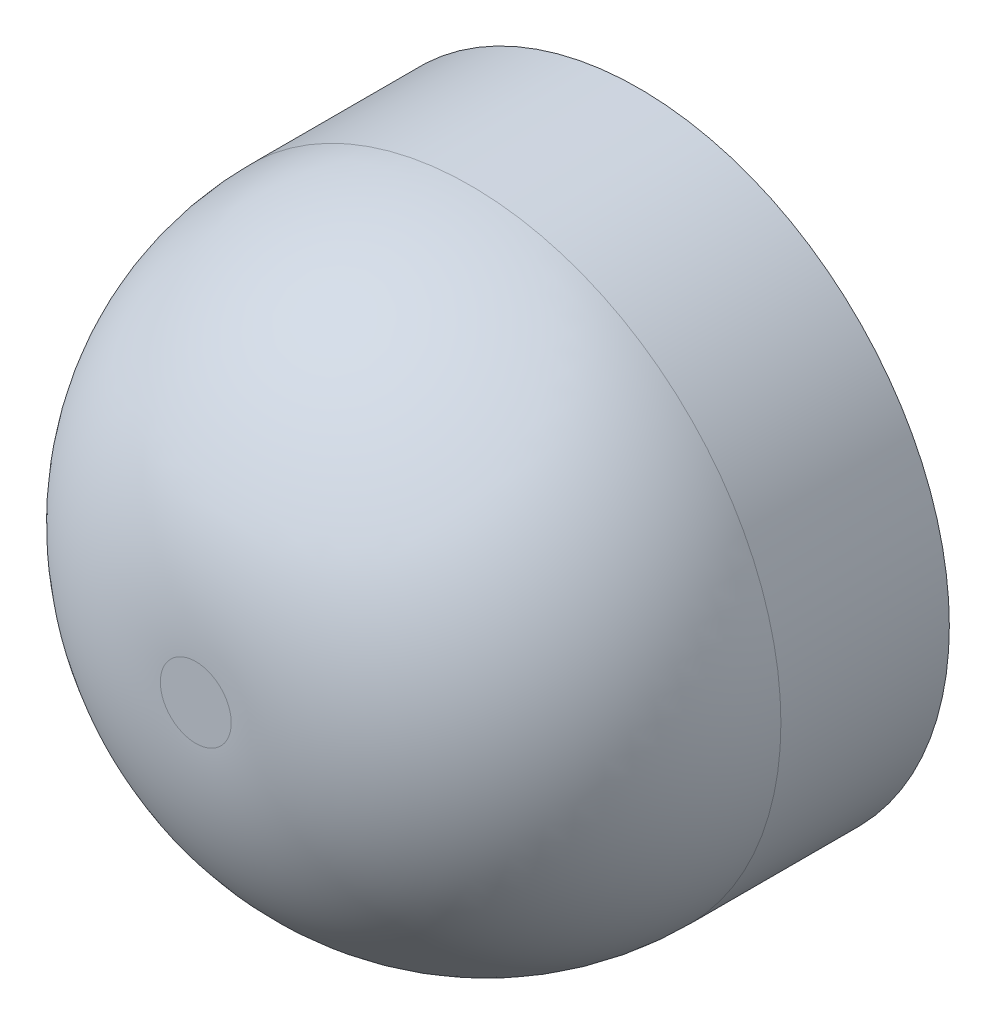
ISO-10303-21;
HEADER;
FILE_DESCRIPTION(('STEP AP214'),'2;1');
FILE_NAME('part.step','',(''),(''),'','','');
FILE_SCHEMA(('AUTOMOTIVE_DESIGN { 1 0 10303 214 1 1 1 1 }'));
ENDSEC;
DATA;
#1=APPLICATION_CONTEXT('core data for automotive mechanical design processes');
#2=APPLICATION_PROTOCOL_DEFINITION('international standard','automotive_design',2000,#1);
#3=PRODUCT_CONTEXT('',#1,'mechanical');
#4=PRODUCT('Part','Part','',(#3));
#5=PRODUCT_RELATED_PRODUCT_CATEGORY('part','',(#4));
#6=PRODUCT_DEFINITION_FORMATION('','',#4);
#7=PRODUCT_DEFINITION_CONTEXT('part definition',#1,'design');
#8=PRODUCT_DEFINITION('design','',#6,#7);
#9=PRODUCT_DEFINITION_SHAPE('','',#8);
#10=(LENGTH_UNIT() NAMED_UNIT(*) SI_UNIT(.MILLI.,.METRE.));
#11=(NAMED_UNIT(*) PLANE_ANGLE_UNIT() SI_UNIT($,.RADIAN.));
#12=(NAMED_UNIT(*) SI_UNIT($,.STERADIAN.) SOLID_ANGLE_UNIT());
#13=UNCERTAINTY_MEASURE_WITH_UNIT(LENGTH_MEASURE(1.E-05),#10,'distance_accuracy_value','');
#14=(GEOMETRIC_REPRESENTATION_CONTEXT(3) GLOBAL_UNCERTAINTY_ASSIGNED_CONTEXT((#13)) GLOBAL_UNIT_ASSIGNED_CONTEXT((#10,
#11,#12)) REPRESENTATION_CONTEXT('',''));
#15=CARTESIAN_POINT('',(0.,0.,0.));
#16=DIRECTION('',(0.,0.,1.));
#17=DIRECTION('',(1.,0.,0.));
#18=AXIS2_PLACEMENT_3D('',#15,#16,#17);
#19=CARTESIAN_POINT('',(0.,0.,5.));
#20=DIRECTION('',(0.,0.,-1.));
#21=DIRECTION('',(-1.,0.,0.));
#22=AXIS2_PLACEMENT_3D('',#19,#20,#21);
#23=CYLINDRICAL_SURFACE('',#22,3.5);
#24=CARTESIAN_POINT('',(0.,0.,1.9));
#25=DIRECTION('',(0.,0.,1.));
#26=DIRECTION('',(1.,0.,0.));
#27=AXIS2_PLACEMENT_3D('',#24,#25,#26);
#28=CIRCLE('',#27,3.5);
#29=CARTESIAN_POINT('',(3.5,0.,1.9));
#30=VERTEX_POINT('',#29);
#31=EDGE_CURVE('E10',#30,#30,#28,.F.);
#32=ORIENTED_EDGE('',*,*,#31,.T.);
#33=EDGE_LOOP('',(#32));
#34=FACE_BOUND('',#33,.T.);
#35=CARTESIAN_POINT('',(0.,0.,0.));
#36=DIRECTION('',(0.,0.,1.));
#37=DIRECTION('',(1.,0.,0.));
#38=AXIS2_PLACEMENT_3D('',#35,#36,#37);
#39=CIRCLE('',#38,3.5);
#40=CARTESIAN_POINT('',(3.5,0.,0.));
#41=VERTEX_POINT('',#40);
#42=EDGE_CURVE('E44',#41,#41,#39,.T.);
#43=ORIENTED_EDGE('',*,*,#42,.T.);
#44=EDGE_LOOP('',(#43));
#45=FACE_BOUND('',#44,.T.);
#46=ADVANCED_FACE('F33',(#34,#45),#23,.T.);
#47=CARTESIAN_POINT('',(0.,0.,5.));
#48=DIRECTION('',(0.,0.,1.));
#49=DIRECTION('',(1.,0.,0.));
#50=AXIS2_PLACEMENT_3D('',#47,#48,#49);
#51=PLANE('',#50);
#52=CARTESIAN_POINT('',(0.,0.,5.));
#53=DIRECTION('',(0.,0.,1.));
#54=DIRECTION('',(1.,0.,0.));
#55=AXIS2_PLACEMENT_3D('',#52,#53,#54);
#56=CIRCLE('',#55,0.400000000000001);
#57=CARTESIAN_POINT('',(0.400000000000001,0.,5.));
#58=VERTEX_POINT('',#57);
#59=EDGE_CURVE('E40',#58,#58,#56,.T.);
#60=ORIENTED_EDGE('',*,*,#59,.T.);
#61=EDGE_LOOP('',(#60));
#62=FACE_BOUND('',#61,.T.);
#63=ADVANCED_FACE('F54',(#62),#51,.T.);
#64=CARTESIAN_POINT('',(0.,0.,0.));
#65=DIRECTION('',(0.,0.,1.));
#66=DIRECTION('',(1.,0.,0.));
#67=AXIS2_PLACEMENT_3D('',#64,#65,#66);
#68=PLANE('',#67);
#69=ORIENTED_EDGE('',*,*,#42,.F.);
#70=EDGE_LOOP('',(#69));
#71=FACE_BOUND('',#70,.T.);
#72=ADVANCED_FACE('F52',(#71),#68,.F.);
#73=CARTESIAN_POINT('',(0.,0.,1.9));
#74=DIRECTION('',(0.,0.,1.));
#75=DIRECTION('',(1.,0.,0.));
#76=AXIS2_PLACEMENT_3D('',#73,#74,#75);
#77=DEGENERATE_TOROIDAL_SURFACE('',#76,0.400000000000001,3.1,.T.);
#78=ORIENTED_EDGE('',*,*,#31,.F.);
#79=EDGE_LOOP('',(#78));
#80=FACE_BOUND('',#79,.T.);
#81=ORIENTED_EDGE('',*,*,#59,.F.);
#82=EDGE_LOOP('',(#81));
#83=FACE_BOUND('',#82,.T.);
#84=ADVANCED_FACE('F35',(#80,#83),#77,.T.);
#85=CLOSED_SHELL('',(#46,#63,#72,#84));
#86=MANIFOLD_SOLID_BREP('B2',#85);
#87=ADVANCED_BREP_SHAPE_REPRESENTATION('',(#18,#86),#14);
#88=SHAPE_DEFINITION_REPRESENTATION(#9,#87);
ENDSEC;
END-ISO-10303-21;
